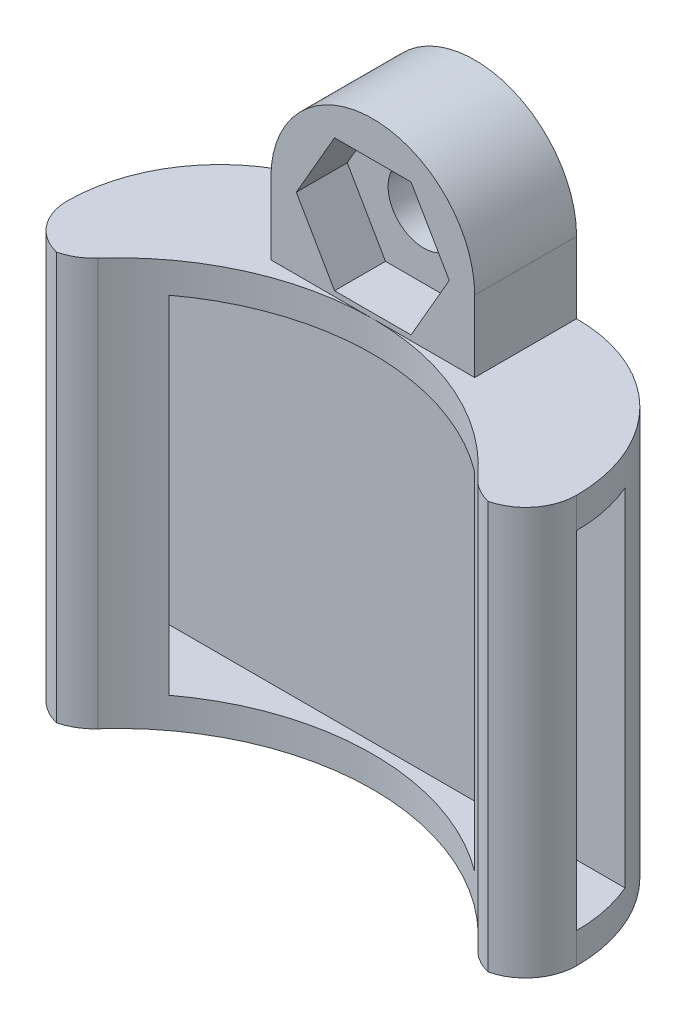
ISO-10303-21;
HEADER;
FILE_DESCRIPTION(('STEP AP214'),'2;1');
FILE_NAME('part.step','',(''),(''),'','','');
FILE_SCHEMA(('AUTOMOTIVE_DESIGN { 1 0 10303 214 1 1 1 1 }'));
ENDSEC;
DATA;
#1=APPLICATION_CONTEXT('core data for automotive mechanical design processes');
#2=APPLICATION_PROTOCOL_DEFINITION('international standard','automotive_design',2000,#1);
#3=PRODUCT_CONTEXT('',#1,'mechanical');
#4=PRODUCT('Part','Part','',(#3));
#5=PRODUCT_RELATED_PRODUCT_CATEGORY('part','',(#4));
#6=PRODUCT_DEFINITION_FORMATION('','',#4);
#7=PRODUCT_DEFINITION_CONTEXT('part definition',#1,'design');
#8=PRODUCT_DEFINITION('design','',#6,#7);
#9=PRODUCT_DEFINITION_SHAPE('','',#8);
#10=(LENGTH_UNIT() NAMED_UNIT(*) SI_UNIT(.MILLI.,.METRE.));
#11=(NAMED_UNIT(*) PLANE_ANGLE_UNIT() SI_UNIT($,.RADIAN.));
#12=(NAMED_UNIT(*) SI_UNIT($,.STERADIAN.) SOLID_ANGLE_UNIT());
#13=UNCERTAINTY_MEASURE_WITH_UNIT(LENGTH_MEASURE(1.E-05),#10,'distance_accuracy_value','');
#14=(GEOMETRIC_REPRESENTATION_CONTEXT(3) GLOBAL_UNCERTAINTY_ASSIGNED_CONTEXT((#13)) GLOBAL_UNIT_ASSIGNED_CONTEXT((#10,
#11,#12)) REPRESENTATION_CONTEXT('',''));
#15=CARTESIAN_POINT('',(0.,0.,0.));
#16=DIRECTION('',(0.,0.,1.));
#17=DIRECTION('',(1.,0.,0.));
#18=AXIS2_PLACEMENT_3D('',#15,#16,#17);
#19=CARTESIAN_POINT('',(0.,-3.5,2.5));
#20=DIRECTION('',(0.,1.,0.));
#21=DIRECTION('',(0.,0.,1.));
#22=AXIS2_PLACEMENT_3D('',#19,#20,#21);
#23=PLANE('',#22);
#24=DIRECTION('',(0.,0.,-1.));
#25=VECTOR('',#24,1.);
#26=CARTESIAN_POINT('',(5.,-3.5,2.5));
#27=LINE('',#26,#25);
#28=CARTESIAN_POINT('',(5.,-3.5,5.));
#29=VERTEX_POINT('',#28);
#30=CARTESIAN_POINT('',(5.,-3.5,0.));
#31=VERTEX_POINT('',#30);
#32=EDGE_CURVE('E60',#29,#31,#27,.T.);
#33=ORIENTED_EDGE('',*,*,#32,.F.);
#34=DIRECTION('',(1.,0.,0.));
#35=VECTOR('',#34,1.);
#36=CARTESIAN_POINT('',(0.,-3.5,5.));
#37=LINE('',#36,#35);
#38=CARTESIAN_POINT('',(0.,-3.5,5.));
#39=VERTEX_POINT('',#38);
#40=EDGE_CURVE('E214',#39,#29,#37,.T.);
#41=ORIENTED_EDGE('',*,*,#40,.F.);
#42=CARTESIAN_POINT('',(0.,-3.5,17.5));
#43=DIRECTION('',(0.,-1.,0.));
#44=DIRECTION('',(1.,0.,0.));
#45=AXIS2_PLACEMENT_3D('',#42,#43,#44);
#46=CIRCLE('',#45,12.5);
#47=CARTESIAN_POINT('',(9.31694990624912,-3.5,9.16666666666667));
#48=VERTEX_POINT('',#47);
#49=EDGE_CURVE('E286',#48,#39,#46,.F.);
#50=ORIENTED_EDGE('',*,*,#49,.F.);
#51=CARTESIAN_POINT('',(11.1803398874989,-3.5,7.5));
#52=DIRECTION('',(0.,1.,0.));
#53=DIRECTION('',(0.,0.,1.));
#54=AXIS2_PLACEMENT_3D('',#51,#52,#53);
#55=CIRCLE('',#54,2.5);
#56=CARTESIAN_POINT('',(10.5901699437495,-3.5,9.92934135878323));
#57=VERTEX_POINT('',#56);
#58=EDGE_CURVE('E376',#48,#57,#55,.T.);
#59=ORIENTED_EDGE('',*,*,#58,.T.);
#60=CARTESIAN_POINT('',(9.99999999999999,-3.5,7.5));
#61=DIRECTION('',(0.,1.,0.));
#62=DIRECTION('',(0.,0.,1.));
#63=AXIS2_PLACEMENT_3D('',#60,#61,#62);
#64=CIRCLE('',#63,2.5);
#65=CARTESIAN_POINT('',(12.5,-3.5,7.5));
#66=VERTEX_POINT('',#65);
#67=EDGE_CURVE('E378',#57,#66,#64,.T.);
#68=ORIENTED_EDGE('',*,*,#67,.T.);
#69=CARTESIAN_POINT('',(4.99999999999999,-3.5,7.5));
#70=DIRECTION('',(0.,1.,0.));
#71=DIRECTION('',(0.,0.,1.));
#72=AXIS2_PLACEMENT_3D('',#69,#70,#71);
#73=CIRCLE('',#72,7.5);
#74=EDGE_CURVE('E336',#66,#31,#73,.T.);
#75=ORIENTED_EDGE('',*,*,#74,.T.);
#76=EDGE_LOOP('',(#33,#41,#50,#59,#68,#75));
#77=FACE_BOUND('',#76,.T.);
#78=ADVANCED_FACE('F35',(#77),#23,.T.);
#79=CARTESIAN_POINT('',(-5.,-3.5,5.));
#80=VERTEX_POINT('',#79);
#81=EDGE_CURVE('E271',#80,#39,#37,.T.);
#82=ORIENTED_EDGE('',*,*,#81,.F.);
#83=DIRECTION('',(0.,0.,-1.));
#84=VECTOR('',#83,1.);
#85=CARTESIAN_POINT('',(-5.,-3.5,2.5));
#86=LINE('',#85,#84);
#87=CARTESIAN_POINT('',(-5.,-3.5,0.));
#88=VERTEX_POINT('',#87);
#89=EDGE_CURVE('E52',#80,#88,#86,.T.);
#90=ORIENTED_EDGE('',*,*,#89,.T.);
#91=CARTESIAN_POINT('',(-4.99999999999999,-3.5,7.5));
#92=DIRECTION('',(0.,1.,0.));
#93=DIRECTION('',(0.,0.,1.));
#94=AXIS2_PLACEMENT_3D('',#91,#92,#93);
#95=CIRCLE('',#94,7.5);
#96=CARTESIAN_POINT('',(-12.5,-3.5,7.5));
#97=VERTEX_POINT('',#96);
#98=EDGE_CURVE('E338',#88,#97,#95,.T.);
#99=ORIENTED_EDGE('',*,*,#98,.T.);
#100=CARTESIAN_POINT('',(-9.99999999999999,-3.5,7.5));
#101=DIRECTION('',(0.,1.,0.));
#102=DIRECTION('',(0.,0.,1.));
#103=AXIS2_PLACEMENT_3D('',#100,#101,#102);
#104=CIRCLE('',#103,2.5);
#105=CARTESIAN_POINT('',(-10.5901699437495,-3.5,9.92934135878323));
#106=VERTEX_POINT('',#105);
#107=EDGE_CURVE('E371',#97,#106,#104,.T.);
#108=ORIENTED_EDGE('',*,*,#107,.T.);
#109=CARTESIAN_POINT('',(-11.180339887499,-3.5,7.5));
#110=DIRECTION('',(0.,1.,0.));
#111=DIRECTION('',(0.,0.,1.));
#112=AXIS2_PLACEMENT_3D('',#109,#110,#111);
#113=CIRCLE('',#112,2.5);
#114=CARTESIAN_POINT('',(-9.31694990624913,-3.5,9.16666666666667));
#115=VERTEX_POINT('',#114);
#116=EDGE_CURVE('E373',#106,#115,#113,.T.);
#117=ORIENTED_EDGE('',*,*,#116,.T.);
#118=EDGE_CURVE('E290',#39,#115,#46,.F.);
#119=ORIENTED_EDGE('',*,*,#118,.F.);
#120=EDGE_LOOP('',(#82,#90,#99,#108,#117,#119));
#121=FACE_BOUND('',#120,.T.);
#122=ADVANCED_FACE('F392',(#121),#23,.T.);
#123=CARTESIAN_POINT('',(-5.,0.,2.5));
#124=DIRECTION('',(1.,0.,0.));
#125=DIRECTION('',(0.,0.,-1.));
#126=AXIS2_PLACEMENT_3D('',#123,#124,#125);
#127=PLANE('',#126);
#128=DIRECTION('',(0.,-1.,0.));
#129=VECTOR('',#128,1.);
#130=CARTESIAN_POINT('',(-5.,0.,0.));
#131=LINE('',#130,#129);
#132=CARTESIAN_POINT('',(-5.,0.,0.));
#133=VERTEX_POINT('',#132);
#134=EDGE_CURVE('E289',#133,#88,#131,.T.);
#135=ORIENTED_EDGE('',*,*,#134,.T.);
#136=ORIENTED_EDGE('',*,*,#89,.F.);
#137=DIRECTION('',(0.,-1.,0.));
#138=VECTOR('',#137,1.);
#139=CARTESIAN_POINT('',(-5.,0.,5.));
#140=LINE('',#139,#138);
#141=CARTESIAN_POINT('',(-5.,0.,5.));
#142=VERTEX_POINT('',#141);
#143=EDGE_CURVE('E219',#142,#80,#140,.T.);
#144=ORIENTED_EDGE('',*,*,#143,.F.);
#145=DIRECTION('',(0.,0.,-1.));
#146=VECTOR('',#145,1.);
#147=CARTESIAN_POINT('',(-5.,0.,2.5));
#148=LINE('',#147,#146);
#149=EDGE_CURVE('E205',#142,#133,#148,.T.);
#150=ORIENTED_EDGE('',*,*,#149,.T.);
#151=EDGE_LOOP('',(#135,#136,#144,#150));
#152=FACE_BOUND('',#151,.T.);
#153=ADVANCED_FACE('F468',(#152),#127,.F.);
#154=CARTESIAN_POINT('',(0.,-23.5,2.5));
#155=DIRECTION('',(0.,1.,0.));
#156=DIRECTION('',(-1.,0.,0.));
#157=AXIS2_PLACEMENT_3D('',#154,#155,#156);
#158=PLANE('',#157);
#159=CARTESIAN_POINT('',(5.00000000000001,-23.5,7.5));
#160=DIRECTION('',(0.,1.,0.));
#161=DIRECTION('',(-1.,0.,0.));
#162=AXIS2_PLACEMENT_3D('',#159,#160,#161);
#163=CIRCLE('',#162,7.5);
#164=CARTESIAN_POINT('',(5.00000000000001,-23.5,0.));
#165=VERTEX_POINT('',#164);
#166=CARTESIAN_POINT('',(12.5,-23.5,7.5));
#167=VERTEX_POINT('',#166);
#168=EDGE_CURVE('E327',#165,#167,#163,.F.);
#169=ORIENTED_EDGE('',*,*,#168,.T.);
#170=CARTESIAN_POINT('',(10.,-23.5,7.5));
#171=DIRECTION('',(0.,1.,0.));
#172=DIRECTION('',(-1.,0.,0.));
#173=AXIS2_PLACEMENT_3D('',#170,#171,#172);
#174=CIRCLE('',#173,2.5);
#175=CARTESIAN_POINT('',(10.5901699437495,-23.5,9.92934135878323));
#176=VERTEX_POINT('',#175);
#177=EDGE_CURVE('E369',#167,#176,#174,.F.);
#178=ORIENTED_EDGE('',*,*,#177,.T.);
#179=CARTESIAN_POINT('',(11.180339887499,-23.5,7.5));
#180=DIRECTION('',(0.,1.,0.));
#181=DIRECTION('',(-1.,0.,0.));
#182=AXIS2_PLACEMENT_3D('',#179,#180,#181);
#183=CIRCLE('',#182,2.5);
#184=CARTESIAN_POINT('',(9.31694990624913,-23.5,9.16666666666667));
#185=VERTEX_POINT('',#184);
#186=EDGE_CURVE('E367',#176,#185,#183,.F.);
#187=ORIENTED_EDGE('',*,*,#186,.T.);
#188=CARTESIAN_POINT('',(0.,-23.5,17.5));
#189=DIRECTION('',(0.,-1.,0.));
#190=DIRECTION('',(1.,0.,0.));
#191=AXIS2_PLACEMENT_3D('',#188,#189,#190);
#192=CIRCLE('',#191,12.5);
#193=CARTESIAN_POINT('',(-9.31694990624912,-23.5,9.16666666666667));
#194=VERTEX_POINT('',#193);
#195=EDGE_CURVE('E291',#185,#194,#192,.F.);
#196=ORIENTED_EDGE('',*,*,#195,.T.);
#197=CARTESIAN_POINT('',(-11.1803398874989,-23.5,7.5));
#198=DIRECTION('',(0.,1.,0.));
#199=DIRECTION('',(-1.,0.,0.));
#200=AXIS2_PLACEMENT_3D('',#197,#198,#199);
#201=CIRCLE('',#200,2.5);
#202=CARTESIAN_POINT('',(-10.5901699437495,-23.5,9.92934135878323));
#203=VERTEX_POINT('',#202);
#204=EDGE_CURVE('E365',#194,#203,#201,.F.);
#205=ORIENTED_EDGE('',*,*,#204,.T.);
#206=CARTESIAN_POINT('',(-10.,-23.5,7.5));
#207=DIRECTION('',(0.,1.,0.));
#208=DIRECTION('',(-1.,0.,0.));
#209=AXIS2_PLACEMENT_3D('',#206,#207,#208);
#210=CIRCLE('',#209,2.5);
#211=CARTESIAN_POINT('',(-12.5,-23.5,7.5));
#212=VERTEX_POINT('',#211);
#213=EDGE_CURVE('E359',#203,#212,#210,.F.);
#214=ORIENTED_EDGE('',*,*,#213,.T.);
#215=CARTESIAN_POINT('',(-5.,-23.5,7.5));
#216=DIRECTION('',(0.,1.,0.));
#217=DIRECTION('',(-1.,0.,0.));
#218=AXIS2_PLACEMENT_3D('',#215,#216,#217);
#219=CIRCLE('',#218,7.5);
#220=CARTESIAN_POINT('',(-5.,-23.5,0.));
#221=VERTEX_POINT('',#220);
#222=EDGE_CURVE('E329',#212,#221,#219,.F.);
#223=ORIENTED_EDGE('',*,*,#222,.T.);
#224=DIRECTION('',(1.,0.,0.));
#225=VECTOR('',#224,1.);
#226=CARTESIAN_POINT('',(0.,-23.5,0.));
#227=LINE('',#226,#225);
#228=EDGE_CURVE('E300',#221,#165,#227,.T.);
#229=ORIENTED_EDGE('',*,*,#228,.T.);
#230=EDGE_LOOP('',(#169,#178,#187,#196,#205,#214,#223,#229));
#231=FACE_BOUND('',#230,.T.);
#232=ADVANCED_FACE('F418',(#231),#158,.F.);
#233=CARTESIAN_POINT('',(5.,0.,2.5));
#234=DIRECTION('',(1.,0.,0.));
#235=DIRECTION('',(0.,0.,-1.));
#236=AXIS2_PLACEMENT_3D('',#233,#234,#235);
#237=PLANE('',#236);
#238=DIRECTION('',(0.,-1.,0.));
#239=VECTOR('',#238,1.);
#240=CARTESIAN_POINT('',(5.,0.,0.));
#241=LINE('',#240,#239);
#242=CARTESIAN_POINT('',(5.,0.,0.));
#243=VERTEX_POINT('',#242);
#244=EDGE_CURVE('E201',#243,#31,#241,.T.);
#245=ORIENTED_EDGE('',*,*,#244,.F.);
#246=DIRECTION('',(0.,0.,-1.));
#247=VECTOR('',#246,1.);
#248=CARTESIAN_POINT('',(5.,0.,2.5));
#249=LINE('',#248,#247);
#250=CARTESIAN_POINT('',(5.,0.,5.));
#251=VERTEX_POINT('',#250);
#252=EDGE_CURVE('E196',#251,#243,#249,.T.);
#253=ORIENTED_EDGE('',*,*,#252,.F.);
#254=DIRECTION('',(0.,1.,0.));
#255=VECTOR('',#254,1.);
#256=CARTESIAN_POINT('',(5.,0.,5.));
#257=LINE('',#256,#255);
#258=EDGE_CURVE('E199',#29,#251,#257,.T.);
#259=ORIENTED_EDGE('',*,*,#258,.F.);
#260=ORIENTED_EDGE('',*,*,#32,.T.);
#261=EDGE_LOOP('',(#245,#253,#259,#260));
#262=FACE_BOUND('',#261,.T.);
#263=ADVANCED_FACE('F198',(#262),#237,.T.);
#264=CARTESIAN_POINT('',(0.,0.,2.5));
#265=DIRECTION('',(0.,0.,-1.));
#266=DIRECTION('',(-1.,0.,0.));
#267=AXIS2_PLACEMENT_3D('',#264,#265,#266);
#268=CYLINDRICAL_SURFACE('',#267,5.);
#269=CARTESIAN_POINT('',(0.,0.,0.));
#270=DIRECTION('',(0.,0.,1.));
#271=DIRECTION('',(1.,0.,0.));
#272=AXIS2_PLACEMENT_3D('',#269,#270,#271);
#273=CIRCLE('',#272,5.);
#274=EDGE_CURVE('E304',#243,#133,#273,.T.);
#275=ORIENTED_EDGE('',*,*,#274,.T.);
#276=ORIENTED_EDGE('',*,*,#149,.F.);
#277=CARTESIAN_POINT('',(0.,0.,5.));
#278=DIRECTION('',(0.,0.,1.));
#279=DIRECTION('',(1.,0.,0.));
#280=AXIS2_PLACEMENT_3D('',#277,#278,#279);
#281=CIRCLE('',#280,5.);
#282=EDGE_CURVE('E212',#251,#142,#281,.T.);
#283=ORIENTED_EDGE('',*,*,#282,.F.);
#284=ORIENTED_EDGE('',*,*,#252,.T.);
#285=EDGE_LOOP('',(#275,#276,#283,#284));
#286=FACE_BOUND('',#285,.T.);
#287=ADVANCED_FACE('F217',(#286),#268,.T.);
#288=CARTESIAN_POINT('',(0.,0.,2.5));
#289=DIRECTION('',(0.,0.,-1.));
#290=DIRECTION('',(-1.,0.,0.));
#291=AXIS2_PLACEMENT_3D('',#288,#289,#290);
#292=CYLINDRICAL_SURFACE('',#291,1.75);
#293=CARTESIAN_POINT('',(0.,0.,2.5));
#294=DIRECTION('',(0.,0.,1.));
#295=DIRECTION('',(1.,0.,0.));
#296=AXIS2_PLACEMENT_3D('',#293,#294,#295);
#297=CIRCLE('',#296,1.75);
#298=CARTESIAN_POINT('',(1.75,0.,2.5));
#299=VERTEX_POINT('',#298);
#300=EDGE_CURVE('E295',#299,#299,#297,.T.);
#301=ORIENTED_EDGE('',*,*,#300,.T.);
#302=EDGE_LOOP('',(#301));
#303=FACE_BOUND('',#302,.T.);
#304=CARTESIAN_POINT('',(0.,0.,0.));
#305=DIRECTION('',(0.,0.,1.));
#306=DIRECTION('',(1.,0.,0.));
#307=AXIS2_PLACEMENT_3D('',#304,#305,#306);
#308=CIRCLE('',#307,1.75);
#309=CARTESIAN_POINT('',(1.75,0.,0.));
#310=VERTEX_POINT('',#309);
#311=EDGE_CURVE('E298',#310,#310,#308,.T.);
#312=ORIENTED_EDGE('',*,*,#311,.F.);
#313=EDGE_LOOP('',(#312));
#314=FACE_BOUND('',#313,.T.);
#315=ADVANCED_FACE('F537',(#303,#314),#292,.F.);
#316=CARTESIAN_POINT('',(0.,0.,2.5));
#317=DIRECTION('',(0.,0.,1.));
#318=DIRECTION('',(1.,0.,0.));
#319=AXIS2_PLACEMENT_3D('',#316,#317,#318);
#320=PLANE('',#319);
#321=DIRECTION('',(0.5,0.866025403784438,0.));
#322=VECTOR('',#321,1.);
#323=CARTESIAN_POINT('',(2.81458256229943,-1.625,2.5));
#324=LINE('',#323,#322);
#325=CARTESIAN_POINT('',(1.87638837486629,-3.25,2.5));
#326=VERTEX_POINT('',#325);
#327=CARTESIAN_POINT('',(3.75277674973257,0.,2.5));
#328=VERTEX_POINT('',#327);
#329=EDGE_CURVE('E242',#326,#328,#324,.T.);
#330=ORIENTED_EDGE('',*,*,#329,.T.);
#331=DIRECTION('',(-0.5,0.866025403784439,0.));
#332=VECTOR('',#331,1.);
#333=CARTESIAN_POINT('',(2.81458256229943,1.625,2.5));
#334=LINE('',#333,#332);
#335=CARTESIAN_POINT('',(1.87638837486628,3.25,2.5));
#336=VERTEX_POINT('',#335);
#337=EDGE_CURVE('E215',#328,#336,#334,.T.);
#338=ORIENTED_EDGE('',*,*,#337,.T.);
#339=DIRECTION('',(-1.,0.,0.));
#340=VECTOR('',#339,1.);
#341=CARTESIAN_POINT('',(0.,3.25,2.5));
#342=LINE('',#341,#340);
#343=CARTESIAN_POINT('',(-1.87638837486628,3.25,2.5));
#344=VERTEX_POINT('',#343);
#345=EDGE_CURVE('E250',#336,#344,#342,.T.);
#346=ORIENTED_EDGE('',*,*,#345,.T.);
#347=DIRECTION('',(-0.5,-0.866025403784438,0.));
#348=VECTOR('',#347,1.);
#349=CARTESIAN_POINT('',(-2.81458256229943,1.625,2.5));
#350=LINE('',#349,#348);
#351=CARTESIAN_POINT('',(-3.75277674973257,0.,2.5));
#352=VERTEX_POINT('',#351);
#353=EDGE_CURVE('E248',#344,#352,#350,.T.);
#354=ORIENTED_EDGE('',*,*,#353,.T.);
#355=DIRECTION('',(0.5,-0.866025403784439,0.));
#356=VECTOR('',#355,1.);
#357=CARTESIAN_POINT('',(-2.81458256229943,-1.625,2.5));
#358=LINE('',#357,#356);
#359=CARTESIAN_POINT('',(-1.87638837486628,-3.25,2.5));
#360=VERTEX_POINT('',#359);
#361=EDGE_CURVE('E246',#352,#360,#358,.T.);
#362=ORIENTED_EDGE('',*,*,#361,.T.);
#363=DIRECTION('',(1.,0.,0.));
#364=VECTOR('',#363,1.);
#365=CARTESIAN_POINT('',(0.,-3.25,2.5));
#366=LINE('',#365,#364);
#367=EDGE_CURVE('E244',#360,#326,#366,.T.);
#368=ORIENTED_EDGE('',*,*,#367,.T.);
#369=EDGE_LOOP('',(#330,#338,#346,#354,#362,#368));
#370=FACE_BOUND('',#369,.T.);
#371=ORIENTED_EDGE('',*,*,#300,.F.);
#372=EDGE_LOOP('',(#371));
#373=FACE_BOUND('',#372,.T.);
#374=ADVANCED_FACE('F543',(#370,#373),#320,.T.);
#375=CARTESIAN_POINT('',(0.,0.,0.));
#376=DIRECTION('',(0.,0.,1.));
#377=DIRECTION('',(1.,0.,0.));
#378=AXIS2_PLACEMENT_3D('',#375,#376,#377);
#379=PLANE('',#378);
#380=ORIENTED_EDGE('',*,*,#228,.F.);
#381=DIRECTION('',(0.,-1.,0.));
#382=VECTOR('',#381,1.);
#383=CARTESIAN_POINT('',(-4.99999999999999,0.,0.));
#384=LINE('',#383,#382);
#385=EDGE_CURVE('E334',#221,#88,#384,.F.);
#386=ORIENTED_EDGE('',*,*,#385,.T.);
#387=ORIENTED_EDGE('',*,*,#134,.F.);
#388=ORIENTED_EDGE('',*,*,#274,.F.);
#389=ORIENTED_EDGE('',*,*,#244,.T.);
#390=DIRECTION('',(0.,-1.,0.));
#391=VECTOR('',#390,1.);
#392=CARTESIAN_POINT('',(5.00000000000001,-23.5,0.));
#393=LINE('',#392,#391);
#394=EDGE_CURVE('E331',#31,#165,#393,.T.);
#395=ORIENTED_EDGE('',*,*,#394,.T.);
#396=EDGE_LOOP('',(#380,#386,#387,#388,#389,#395));
#397=FACE_BOUND('',#396,.T.);
#398=ORIENTED_EDGE('',*,*,#311,.T.);
#399=EDGE_LOOP('',(#398));
#400=FACE_BOUND('',#399,.T.);
#401=ADVANCED_FACE('F414',(#397,#400),#379,.F.);
#402=CARTESIAN_POINT('',(0.,-3.5,17.5));
#403=DIRECTION('',(0.,-1.,0.));
#404=DIRECTION('',(1.,0.,0.));
#405=AXIS2_PLACEMENT_3D('',#402,#403,#404);
#406=CYLINDRICAL_SURFACE('',#405,12.5);
#407=DIRECTION('',(0.,-1.,0.));
#408=VECTOR('',#407,1.);
#409=CARTESIAN_POINT('',(-7.5,-3.5,7.5));
#410=LINE('',#409,#408);
#411=CARTESIAN_POINT('',(-7.5,-5.,7.5));
#412=VERTEX_POINT('',#411);
#413=CARTESIAN_POINT('',(-7.5,-22.,7.5));
#414=VERTEX_POINT('',#413);
#415=EDGE_CURVE('E315',#412,#414,#410,.T.);
#416=ORIENTED_EDGE('',*,*,#415,.F.);
#417=CARTESIAN_POINT('',(0.,-5.00000000000001,17.5));
#418=DIRECTION('',(0.,1.,0.));
#419=DIRECTION('',(-1.,0.,0.));
#420=AXIS2_PLACEMENT_3D('',#417,#418,#419);
#421=CIRCLE('',#420,12.5);
#422=CARTESIAN_POINT('',(7.5,-5.00000000000001,7.5));
#423=VERTEX_POINT('',#422);
#424=EDGE_CURVE('E318',#423,#412,#421,.T.);
#425=ORIENTED_EDGE('',*,*,#424,.F.);
#426=DIRECTION('',(0.,-1.,0.));
#427=VECTOR('',#426,1.);
#428=CARTESIAN_POINT('',(7.5,-3.5,7.5));
#429=LINE('',#428,#427);
#430=CARTESIAN_POINT('',(7.5,-22.,7.5));
#431=VERTEX_POINT('',#430);
#432=EDGE_CURVE('E313',#431,#423,#429,.F.);
#433=ORIENTED_EDGE('',*,*,#432,.F.);
#434=CARTESIAN_POINT('',(0.,-22.,17.5));
#435=DIRECTION('',(0.,-1.,0.));
#436=DIRECTION('',(1.,0.,0.));
#437=AXIS2_PLACEMENT_3D('',#434,#435,#436);
#438=CIRCLE('',#437,12.5);
#439=EDGE_CURVE('E311',#414,#431,#438,.T.);
#440=ORIENTED_EDGE('',*,*,#439,.F.);
#441=EDGE_LOOP('',(#416,#425,#433,#440));
#442=FACE_BOUND('',#441,.T.);
#443=ORIENTED_EDGE('',*,*,#195,.F.);
#444=DIRECTION('',(0.,-1.,0.));
#445=VECTOR('',#444,1.);
#446=CARTESIAN_POINT('',(9.31694990624912,-3.5,9.16666666666667));
#447=LINE('',#446,#445);
#448=EDGE_CURVE('E11',#185,#48,#447,.F.);
#449=ORIENTED_EDGE('',*,*,#448,.T.);
#450=ORIENTED_EDGE('',*,*,#49,.T.);
#451=ORIENTED_EDGE('',*,*,#118,.T.);
#452=DIRECTION('',(0.,-1.,0.));
#453=VECTOR('',#452,1.);
#454=CARTESIAN_POINT('',(-9.31694990624913,-3.5,9.16666666666667));
#455=LINE('',#454,#453);
#456=EDGE_CURVE('E44',#115,#194,#455,.T.);
#457=ORIENTED_EDGE('',*,*,#456,.T.);
#458=EDGE_LOOP('',(#443,#449,#450,#451,#457));
#459=FACE_BOUND('',#458,.T.);
#460=ADVANCED_FACE('F397',(#442,#459),#406,.F.);
#461=CARTESIAN_POINT('',(26.5,-22.,7.5));
#462=DIRECTION('',(0.,0.,1.));
#463=DIRECTION('',(1.,0.,0.));
#464=AXIS2_PLACEMENT_3D('',#461,#462,#463);
#465=PLANE('',#464);
#466=ORIENTED_EDGE('',*,*,#415,.T.);
#467=DIRECTION('',(-1.,0.,0.));
#468=VECTOR('',#467,1.);
#469=CARTESIAN_POINT('',(26.5,-22.,7.5));
#470=LINE('',#469,#468);
#471=CARTESIAN_POINT('',(-12.5,-22.,7.5));
#472=VERTEX_POINT('',#471);
#473=EDGE_CURVE('E279',#414,#472,#470,.T.);
#474=ORIENTED_EDGE('',*,*,#473,.T.);
#475=DIRECTION('',(0.,-1.,0.));
#476=VECTOR('',#475,1.);
#477=CARTESIAN_POINT('',(-12.5,-13.5,7.5));
#478=LINE('',#477,#476);
#479=CARTESIAN_POINT('',(-12.5,-5.,7.5));
#480=VERTEX_POINT('',#479);
#481=EDGE_CURVE('E346',#472,#480,#478,.F.);
#482=ORIENTED_EDGE('',*,*,#481,.T.);
#483=DIRECTION('',(-1.,0.,0.));
#484=VECTOR('',#483,1.);
#485=CARTESIAN_POINT('',(26.5,-5.00000000000001,7.5));
#486=LINE('',#485,#484);
#487=EDGE_CURVE('E276',#412,#480,#486,.T.);
#488=ORIENTED_EDGE('',*,*,#487,.F.);
#489=EDGE_LOOP('',(#466,#474,#482,#488));
#490=FACE_BOUND('',#489,.T.);
#491=ADVANCED_FACE('F433',(#490),#465,.F.);
#492=CARTESIAN_POINT('',(26.5,-22.,4.5));
#493=DIRECTION('',(0.,0.,-1.));
#494=DIRECTION('',(-1.,0.,0.));
#495=AXIS2_PLACEMENT_3D('',#492,#493,#494);
#496=PLANE('',#495);
#497=DIRECTION('',(0.,1.,0.));
#498=VECTOR('',#497,1.);
#499=CARTESIAN_POINT('',(11.8738635424338,-13.5,4.5));
#500=LINE('',#499,#498);
#501=CARTESIAN_POINT('',(11.8738635424338,-22.,4.5));
#502=VERTEX_POINT('',#501);
#503=CARTESIAN_POINT('',(11.8738635424338,-5.00000000000001,4.5));
#504=VERTEX_POINT('',#503);
#505=EDGE_CURVE('E320',#502,#504,#500,.T.);
#506=ORIENTED_EDGE('',*,*,#505,.T.);
#507=DIRECTION('',(-1.,0.,0.));
#508=VECTOR('',#507,1.);
#509=CARTESIAN_POINT('',(26.5,-5.00000000000001,4.5));
#510=LINE('',#509,#508);
#511=CARTESIAN_POINT('',(-11.8738635424337,-5.,4.5));
#512=VERTEX_POINT('',#511);
#513=EDGE_CURVE('E272',#504,#512,#510,.T.);
#514=ORIENTED_EDGE('',*,*,#513,.T.);
#515=DIRECTION('',(0.,-1.,0.));
#516=VECTOR('',#515,1.);
#517=CARTESIAN_POINT('',(-11.8738635424338,-13.5,4.5));
#518=LINE('',#517,#516);
#519=CARTESIAN_POINT('',(-11.8738635424338,-22.,4.5));
#520=VERTEX_POINT('',#519);
#521=EDGE_CURVE('E353',#512,#520,#518,.T.);
#522=ORIENTED_EDGE('',*,*,#521,.T.);
#523=DIRECTION('',(-1.,0.,0.));
#524=VECTOR('',#523,1.);
#525=CARTESIAN_POINT('',(26.5,-22.,4.5));
#526=LINE('',#525,#524);
#527=EDGE_CURVE('E282',#502,#520,#526,.T.);
#528=ORIENTED_EDGE('',*,*,#527,.F.);
#529=EDGE_LOOP('',(#506,#514,#522,#528));
#530=FACE_BOUND('',#529,.T.);
#531=ADVANCED_FACE('F567',(#530),#496,.F.);
#532=CARTESIAN_POINT('',(26.5,-5.00000000000001,4.5));
#533=DIRECTION('',(0.,1.,0.));
#534=DIRECTION('',(-1.,0.,0.));
#535=AXIS2_PLACEMENT_3D('',#532,#533,#534);
#536=PLANE('',#535);
#537=CARTESIAN_POINT('',(-4.99999999999999,-5.00000000000001,7.5));
#538=DIRECTION('',(0.,1.,0.));
#539=DIRECTION('',(-1.,0.,0.));
#540=AXIS2_PLACEMENT_3D('',#537,#538,#539);
#541=CIRCLE('',#540,7.5);
#542=EDGE_CURVE('E285',#480,#512,#541,.F.);
#543=ORIENTED_EDGE('',*,*,#542,.T.);
#544=ORIENTED_EDGE('',*,*,#513,.F.);
#545=CARTESIAN_POINT('',(4.99999999999999,-5.00000000000001,7.5));
#546=DIRECTION('',(0.,1.,0.));
#547=DIRECTION('',(-1.,0.,0.));
#548=AXIS2_PLACEMENT_3D('',#545,#546,#547);
#549=CIRCLE('',#548,7.5);
#550=CARTESIAN_POINT('',(12.5,-5.00000000000001,7.5));
#551=VERTEX_POINT('',#550);
#552=EDGE_CURVE('E294',#504,#551,#549,.F.);
#553=ORIENTED_EDGE('',*,*,#552,.T.);
#554=EDGE_CURVE('E275',#551,#423,#486,.T.);
#555=ORIENTED_EDGE('',*,*,#554,.T.);
#556=ORIENTED_EDGE('',*,*,#424,.T.);
#557=ORIENTED_EDGE('',*,*,#487,.T.);
#558=EDGE_LOOP('',(#543,#544,#553,#555,#556,#557));
#559=FACE_BOUND('',#558,.T.);
#560=ADVANCED_FACE('F438',(#559),#536,.F.);
#561=DIRECTION('',(0.,1.,0.));
#562=VECTOR('',#561,1.);
#563=CARTESIAN_POINT('',(12.5,-13.5,7.5));
#564=LINE('',#563,#562);
#565=CARTESIAN_POINT('',(12.5,-22.,7.5));
#566=VERTEX_POINT('',#565);
#567=EDGE_CURVE('E349',#551,#566,#564,.F.);
#568=ORIENTED_EDGE('',*,*,#567,.T.);
#569=EDGE_CURVE('E278',#566,#431,#470,.T.);
#570=ORIENTED_EDGE('',*,*,#569,.T.);
#571=ORIENTED_EDGE('',*,*,#432,.T.);
#572=ORIENTED_EDGE('',*,*,#554,.F.);
#573=EDGE_LOOP('',(#568,#570,#571,#572));
#574=FACE_BOUND('',#573,.T.);
#575=ADVANCED_FACE('F449',(#574),#465,.F.);
#576=CARTESIAN_POINT('',(26.5,-22.,4.5));
#577=DIRECTION('',(0.,-1.,0.));
#578=DIRECTION('',(1.,0.,0.));
#579=AXIS2_PLACEMENT_3D('',#576,#577,#578);
#580=PLANE('',#579);
#581=CARTESIAN_POINT('',(5.00000000000001,-22.,7.5));
#582=DIRECTION('',(0.,-1.,0.));
#583=DIRECTION('',(1.,0.,0.));
#584=AXIS2_PLACEMENT_3D('',#581,#582,#583);
#585=CIRCLE('',#584,7.5);
#586=EDGE_CURVE('E274',#566,#502,#585,.F.);
#587=ORIENTED_EDGE('',*,*,#586,.T.);
#588=ORIENTED_EDGE('',*,*,#527,.T.);
#589=CARTESIAN_POINT('',(-5.,-22.,7.5));
#590=DIRECTION('',(0.,-1.,0.));
#591=DIRECTION('',(1.,0.,0.));
#592=AXIS2_PLACEMENT_3D('',#589,#590,#591);
#593=CIRCLE('',#592,7.5);
#594=EDGE_CURVE('E352',#520,#472,#593,.F.);
#595=ORIENTED_EDGE('',*,*,#594,.T.);
#596=ORIENTED_EDGE('',*,*,#473,.F.);
#597=ORIENTED_EDGE('',*,*,#439,.T.);
#598=ORIENTED_EDGE('',*,*,#569,.F.);
#599=EDGE_LOOP('',(#587,#588,#595,#596,#597,#598));
#600=FACE_BOUND('',#599,.T.);
#601=ADVANCED_FACE('F447',(#600),#580,.F.);
#602=CARTESIAN_POINT('',(-4.99999999999999,0.,7.5));
#603=DIRECTION('',(0.,-1.,0.));
#604=DIRECTION('',(1.,0.,0.));
#605=AXIS2_PLACEMENT_3D('',#602,#603,#604);
#606=CYLINDRICAL_SURFACE('',#605,7.5);
#607=ORIENTED_EDGE('',*,*,#98,.F.);
#608=ORIENTED_EDGE('',*,*,#385,.F.);
#609=ORIENTED_EDGE('',*,*,#222,.F.);
#610=DIRECTION('',(0.,-1.,0.));
#611=VECTOR('',#610,1.);
#612=CARTESIAN_POINT('',(-12.5,0.,7.5));
#613=LINE('',#612,#611);
#614=EDGE_CURVE('E321',#472,#212,#613,.T.);
#615=ORIENTED_EDGE('',*,*,#614,.F.);
#616=ORIENTED_EDGE('',*,*,#594,.F.);
#617=ORIENTED_EDGE('',*,*,#521,.F.);
#618=ORIENTED_EDGE('',*,*,#542,.F.);
#619=DIRECTION('',(0.,-1.,0.));
#620=VECTOR('',#619,1.);
#621=CARTESIAN_POINT('',(-12.5,0.,7.5));
#622=LINE('',#621,#620);
#623=EDGE_CURVE('E324',#97,#480,#622,.T.);
#624=ORIENTED_EDGE('',*,*,#623,.F.);
#625=EDGE_LOOP('',(#607,#608,#609,#615,#616,#617,#618,#624));
#626=FACE_BOUND('',#625,.T.);
#627=ADVANCED_FACE('F424',(#626),#606,.T.);
#628=CARTESIAN_POINT('',(4.99999999999999,0.,7.5));
#629=DIRECTION('',(0.,1.,0.));
#630=DIRECTION('',(-1.,0.,0.));
#631=AXIS2_PLACEMENT_3D('',#628,#629,#630);
#632=CYLINDRICAL_SURFACE('',#631,7.5);
#633=ORIENTED_EDGE('',*,*,#586,.F.);
#634=DIRECTION('',(0.,-1.,0.));
#635=VECTOR('',#634,1.);
#636=CARTESIAN_POINT('',(12.5,-3.5,7.5));
#637=LINE('',#636,#635);
#638=EDGE_CURVE('E343',#167,#566,#637,.F.);
#639=ORIENTED_EDGE('',*,*,#638,.F.);
#640=ORIENTED_EDGE('',*,*,#168,.F.);
#641=ORIENTED_EDGE('',*,*,#394,.F.);
#642=ORIENTED_EDGE('',*,*,#74,.F.);
#643=DIRECTION('',(0.,-1.,0.));
#644=VECTOR('',#643,1.);
#645=CARTESIAN_POINT('',(12.5,-3.5,7.5));
#646=LINE('',#645,#644);
#647=EDGE_CURVE('E340',#551,#66,#646,.F.);
#648=ORIENTED_EDGE('',*,*,#647,.F.);
#649=ORIENTED_EDGE('',*,*,#552,.F.);
#650=ORIENTED_EDGE('',*,*,#505,.F.);
#651=EDGE_LOOP('',(#633,#639,#640,#641,#642,#648,#649,#650));
#652=FACE_BOUND('',#651,.T.);
#653=ADVANCED_FACE('F409',(#652),#632,.T.);
#654=CARTESIAN_POINT('',(11.1803398874989,-3.5,7.5));
#655=DIRECTION('',(0.,-1.,0.));
#656=DIRECTION('',(1.,0.,0.));
#657=AXIS2_PLACEMENT_3D('',#654,#655,#656);
#658=CYLINDRICAL_SURFACE('',#657,2.5);
#659=DIRECTION('',(0.,-1.,0.));
#660=VECTOR('',#659,1.);
#661=CARTESIAN_POINT('',(10.5901699437495,-13.5,9.92934135878323));
#662=LINE('',#661,#660);
#663=EDGE_CURVE('E355',#57,#176,#662,.T.);
#664=ORIENTED_EDGE('',*,*,#663,.F.);
#665=ORIENTED_EDGE('',*,*,#58,.F.);
#666=ORIENTED_EDGE('',*,*,#448,.F.);
#667=ORIENTED_EDGE('',*,*,#186,.F.);
#668=EDGE_LOOP('',(#664,#665,#666,#667));
#669=FACE_BOUND('',#668,.T.);
#670=ADVANCED_FACE('F401',(#669),#658,.T.);
#671=CARTESIAN_POINT('',(9.99999999999999,0.,7.5));
#672=DIRECTION('',(0.,1.,0.));
#673=DIRECTION('',(-1.,0.,0.));
#674=AXIS2_PLACEMENT_3D('',#671,#672,#673);
#675=CYLINDRICAL_SURFACE('',#674,2.5);
#676=ORIENTED_EDGE('',*,*,#67,.F.);
#677=ORIENTED_EDGE('',*,*,#663,.T.);
#678=ORIENTED_EDGE('',*,*,#177,.F.);
#679=ORIENTED_EDGE('',*,*,#638,.T.);
#680=ORIENTED_EDGE('',*,*,#567,.F.);
#681=ORIENTED_EDGE('',*,*,#647,.T.);
#682=EDGE_LOOP('',(#676,#677,#678,#679,#680,#681));
#683=FACE_BOUND('',#682,.T.);
#684=ADVANCED_FACE('F403',(#683),#675,.T.);
#685=CARTESIAN_POINT('',(-9.99999999999999,-3.5,7.5));
#686=DIRECTION('',(0.,-1.,0.));
#687=DIRECTION('',(1.,0.,0.));
#688=AXIS2_PLACEMENT_3D('',#685,#686,#687);
#689=CYLINDRICAL_SURFACE('',#688,2.5);
#690=DIRECTION('',(0.,-1.,0.));
#691=VECTOR('',#690,1.);
#692=CARTESIAN_POINT('',(-10.5901699437495,-13.5,9.92934135878323));
#693=LINE('',#692,#691);
#694=EDGE_CURVE('E39',#106,#203,#693,.T.);
#695=ORIENTED_EDGE('',*,*,#694,.F.);
#696=ORIENTED_EDGE('',*,*,#107,.F.);
#697=ORIENTED_EDGE('',*,*,#623,.T.);
#698=ORIENTED_EDGE('',*,*,#481,.F.);
#699=ORIENTED_EDGE('',*,*,#614,.T.);
#700=ORIENTED_EDGE('',*,*,#213,.F.);
#701=EDGE_LOOP('',(#695,#696,#697,#698,#699,#700));
#702=FACE_BOUND('',#701,.T.);
#703=ADVANCED_FACE('F37',(#702),#689,.T.);
#704=CARTESIAN_POINT('',(-11.180339887499,-3.5,7.5));
#705=DIRECTION('',(0.,-1.,0.));
#706=DIRECTION('',(1.,0.,0.));
#707=AXIS2_PLACEMENT_3D('',#704,#705,#706);
#708=CYLINDRICAL_SURFACE('',#707,2.5);
#709=ORIENTED_EDGE('',*,*,#116,.F.);
#710=ORIENTED_EDGE('',*,*,#694,.T.);
#711=ORIENTED_EDGE('',*,*,#204,.F.);
#712=ORIENTED_EDGE('',*,*,#456,.F.);
#713=EDGE_LOOP('',(#709,#710,#711,#712));
#714=FACE_BOUND('',#713,.T.);
#715=ADVANCED_FACE('F452',(#714),#708,.T.);
#716=CARTESIAN_POINT('',(2.81458256229943,-1.625,5.));
#717=DIRECTION('',(-0.866025403784438,0.5,0.));
#718=DIRECTION('',(-0.5,-0.866025403784438,0.));
#719=AXIS2_PLACEMENT_3D('',#716,#717,#718);
#720=PLANE('',#719);
#721=ORIENTED_EDGE('',*,*,#329,.F.);
#722=DIRECTION('',(0.,0.,-1.));
#723=VECTOR('',#722,1.);
#724=CARTESIAN_POINT('',(1.87638837486629,-3.25,5.));
#725=LINE('',#724,#723);
#726=CARTESIAN_POINT('',(1.87638837486629,-3.25,5.));
#727=VERTEX_POINT('',#726);
#728=EDGE_CURVE('E267',#727,#326,#725,.T.);
#729=ORIENTED_EDGE('',*,*,#728,.F.);
#730=DIRECTION('',(0.5,0.866025403784438,0.));
#731=VECTOR('',#730,1.);
#732=CARTESIAN_POINT('',(2.81458256229943,-1.625,5.));
#733=LINE('',#732,#731);
#734=CARTESIAN_POINT('',(3.75277674973257,0.,5.));
#735=VERTEX_POINT('',#734);
#736=EDGE_CURVE('E221',#727,#735,#733,.T.);
#737=ORIENTED_EDGE('',*,*,#736,.T.);
#738=DIRECTION('',(0.,0.,-1.));
#739=VECTOR('',#738,1.);
#740=CARTESIAN_POINT('',(3.75277674973257,0.,5.));
#741=LINE('',#740,#739);
#742=EDGE_CURVE('E241',#735,#328,#741,.T.);
#743=ORIENTED_EDGE('',*,*,#742,.T.);
#744=EDGE_LOOP('',(#721,#729,#737,#743));
#745=FACE_BOUND('',#744,.T.);
#746=ADVANCED_FACE('F454',(#745),#720,.T.);
#747=CARTESIAN_POINT('',(0.,-3.25,5.));
#748=DIRECTION('',(0.,1.,0.));
#749=DIRECTION('',(-1.,0.,0.));
#750=AXIS2_PLACEMENT_3D('',#747,#748,#749);
#751=PLANE('',#750);
#752=ORIENTED_EDGE('',*,*,#367,.F.);
#753=DIRECTION('',(0.,0.,-1.));
#754=VECTOR('',#753,1.);
#755=CARTESIAN_POINT('',(-1.87638837486628,-3.25,5.));
#756=LINE('',#755,#754);
#757=CARTESIAN_POINT('',(-1.87638837486628,-3.25,5.));
#758=VERTEX_POINT('',#757);
#759=EDGE_CURVE('E264',#758,#360,#756,.T.);
#760=ORIENTED_EDGE('',*,*,#759,.F.);
#761=DIRECTION('',(1.,0.,0.));
#762=VECTOR('',#761,1.);
#763=CARTESIAN_POINT('',(0.,-3.25,5.));
#764=LINE('',#763,#762);
#765=EDGE_CURVE('E226',#758,#727,#764,.T.);
#766=ORIENTED_EDGE('',*,*,#765,.T.);
#767=ORIENTED_EDGE('',*,*,#728,.T.);
#768=EDGE_LOOP('',(#752,#760,#766,#767));
#769=FACE_BOUND('',#768,.T.);
#770=ADVANCED_FACE('F459',(#769),#751,.T.);
#771=CARTESIAN_POINT('',(-2.81458256229943,-1.625,5.));
#772=DIRECTION('',(0.866025403784439,0.5,0.));
#773=DIRECTION('',(-0.5,0.866025403784439,0.));
#774=AXIS2_PLACEMENT_3D('',#771,#772,#773);
#775=PLANE('',#774);
#776=ORIENTED_EDGE('',*,*,#361,.F.);
#777=DIRECTION('',(0.,0.,-1.));
#778=VECTOR('',#777,1.);
#779=CARTESIAN_POINT('',(-3.75277674973257,0.,5.));
#780=LINE('',#779,#778);
#781=CARTESIAN_POINT('',(-3.75277674973257,0.,5.));
#782=VERTEX_POINT('',#781);
#783=EDGE_CURVE('E261',#782,#352,#780,.T.);
#784=ORIENTED_EDGE('',*,*,#783,.F.);
#785=DIRECTION('',(0.5,-0.866025403784439,0.));
#786=VECTOR('',#785,1.);
#787=CARTESIAN_POINT('',(-2.81458256229943,-1.625,5.));
#788=LINE('',#787,#786);
#789=EDGE_CURVE('E229',#782,#758,#788,.T.);
#790=ORIENTED_EDGE('',*,*,#789,.T.);
#791=ORIENTED_EDGE('',*,*,#759,.T.);
#792=EDGE_LOOP('',(#776,#784,#790,#791));
#793=FACE_BOUND('',#792,.T.);
#794=ADVANCED_FACE('F596',(#793),#775,.T.);
#795=CARTESIAN_POINT('',(-2.81458256229943,1.625,5.));
#796=DIRECTION('',(0.866025403784438,-0.5,0.));
#797=DIRECTION('',(0.5,0.866025403784438,0.));
#798=AXIS2_PLACEMENT_3D('',#795,#796,#797);
#799=PLANE('',#798);
#800=ORIENTED_EDGE('',*,*,#353,.F.);
#801=DIRECTION('',(0.,0.,-1.));
#802=VECTOR('',#801,1.);
#803=CARTESIAN_POINT('',(-1.87638837486628,3.25,5.));
#804=LINE('',#803,#802);
#805=CARTESIAN_POINT('',(-1.87638837486628,3.25,5.));
#806=VERTEX_POINT('',#805);
#807=EDGE_CURVE('E258',#806,#344,#804,.T.);
#808=ORIENTED_EDGE('',*,*,#807,.F.);
#809=DIRECTION('',(-0.5,-0.866025403784438,0.));
#810=VECTOR('',#809,1.);
#811=CARTESIAN_POINT('',(-2.81458256229943,1.625,5.));
#812=LINE('',#811,#810);
#813=EDGE_CURVE('E232',#806,#782,#812,.T.);
#814=ORIENTED_EDGE('',*,*,#813,.T.);
#815=ORIENTED_EDGE('',*,*,#783,.T.);
#816=EDGE_LOOP('',(#800,#808,#814,#815));
#817=FACE_BOUND('',#816,.T.);
#818=ADVANCED_FACE('F606',(#817),#799,.T.);
#819=CARTESIAN_POINT('',(0.,3.25,5.));
#820=DIRECTION('',(0.,-1.,0.));
#821=DIRECTION('',(1.,0.,0.));
#822=AXIS2_PLACEMENT_3D('',#819,#820,#821);
#823=PLANE('',#822);
#824=ORIENTED_EDGE('',*,*,#345,.F.);
#825=DIRECTION('',(0.,0.,-1.));
#826=VECTOR('',#825,1.);
#827=CARTESIAN_POINT('',(1.87638837486628,3.25,5.));
#828=LINE('',#827,#826);
#829=CARTESIAN_POINT('',(1.87638837486628,3.25,5.));
#830=VERTEX_POINT('',#829);
#831=EDGE_CURVE('E255',#830,#336,#828,.T.);
#832=ORIENTED_EDGE('',*,*,#831,.F.);
#833=DIRECTION('',(-1.,0.,0.));
#834=VECTOR('',#833,1.);
#835=CARTESIAN_POINT('',(0.,3.25,5.));
#836=LINE('',#835,#834);
#837=EDGE_CURVE('E235',#830,#806,#836,.T.);
#838=ORIENTED_EDGE('',*,*,#837,.T.);
#839=ORIENTED_EDGE('',*,*,#807,.T.);
#840=EDGE_LOOP('',(#824,#832,#838,#839));
#841=FACE_BOUND('',#840,.T.);
#842=ADVANCED_FACE('F616',(#841),#823,.T.);
#843=CARTESIAN_POINT('',(2.81458256229943,1.625,5.));
#844=DIRECTION('',(-0.866025403784439,-0.5,0.));
#845=DIRECTION('',(0.5,-0.866025403784439,0.));
#846=AXIS2_PLACEMENT_3D('',#843,#844,#845);
#847=PLANE('',#846);
#848=ORIENTED_EDGE('',*,*,#337,.F.);
#849=ORIENTED_EDGE('',*,*,#742,.F.);
#850=DIRECTION('',(-0.5,0.866025403784439,0.));
#851=VECTOR('',#850,1.);
#852=CARTESIAN_POINT('',(2.81458256229943,1.625,5.));
#853=LINE('',#852,#851);
#854=EDGE_CURVE('E238',#735,#830,#853,.T.);
#855=ORIENTED_EDGE('',*,*,#854,.T.);
#856=ORIENTED_EDGE('',*,*,#831,.T.);
#857=EDGE_LOOP('',(#848,#849,#855,#856));
#858=FACE_BOUND('',#857,.T.);
#859=ADVANCED_FACE('F626',(#858),#847,.T.);
#860=CARTESIAN_POINT('',(0.,0.,5.));
#861=DIRECTION('',(0.,0.,1.));
#862=DIRECTION('',(1.,0.,0.));
#863=AXIS2_PLACEMENT_3D('',#860,#861,#862);
#864=PLANE('',#863);
#865=ORIENTED_EDGE('',*,*,#143,.T.);
#866=ORIENTED_EDGE('',*,*,#81,.T.);
#867=ORIENTED_EDGE('',*,*,#40,.T.);
#868=ORIENTED_EDGE('',*,*,#258,.T.);
#869=ORIENTED_EDGE('',*,*,#282,.T.);
#870=EDGE_LOOP('',(#865,#866,#867,#868,#869));
#871=FACE_BOUND('',#870,.T.);
#872=ORIENTED_EDGE('',*,*,#736,.F.);
#873=ORIENTED_EDGE('',*,*,#765,.F.);
#874=ORIENTED_EDGE('',*,*,#789,.F.);
#875=ORIENTED_EDGE('',*,*,#813,.F.);
#876=ORIENTED_EDGE('',*,*,#837,.F.);
#877=ORIENTED_EDGE('',*,*,#854,.F.);
#878=EDGE_LOOP('',(#872,#873,#874,#875,#876,#877));
#879=FACE_BOUND('',#878,.T.);
#880=ADVANCED_FACE('F210',(#871,#879),#864,.T.);
#881=CLOSED_SHELL('',(#78,#122,#153,#232,#263,#287,#315,#374,#401,#460,#491,#531,#560,#575,#601,
#627,#653,#670,#684,#703,#715,#746,#770,#794,#818,#842,#859,#880));
#882=MANIFOLD_SOLID_BREP('B2',#881);
#883=ADVANCED_BREP_SHAPE_REPRESENTATION('',(#18,#882),#14);
#884=SHAPE_DEFINITION_REPRESENTATION(#9,#883);
ENDSEC;
END-ISO-10303-21;
